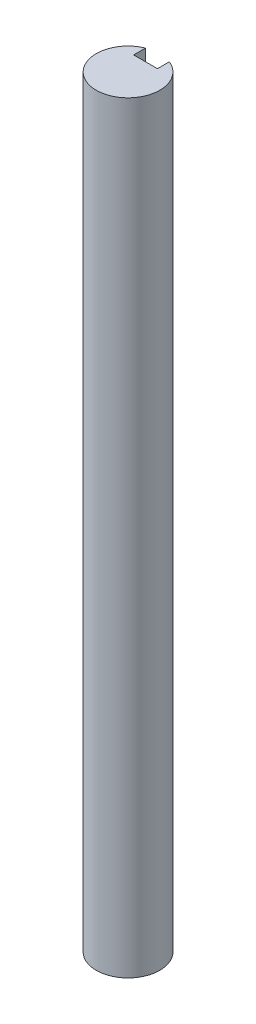
ISO-10303-21;
HEADER;
FILE_DESCRIPTION(('STEP AP214'),'2;1');
FILE_NAME('part.step','',(''),(''),'','','');
FILE_SCHEMA(('AUTOMOTIVE_DESIGN { 1 0 10303 214 1 1 1 1 }'));
ENDSEC;
DATA;
#1=APPLICATION_CONTEXT('core data for automotive mechanical design processes');
#2=APPLICATION_PROTOCOL_DEFINITION('international standard','automotive_design',2000,#1);
#3=PRODUCT_CONTEXT('',#1,'mechanical');
#4=PRODUCT('Part','Part','',(#3));
#5=PRODUCT_RELATED_PRODUCT_CATEGORY('part','',(#4));
#6=PRODUCT_DEFINITION_FORMATION('','',#4);
#7=PRODUCT_DEFINITION_CONTEXT('part definition',#1,'design');
#8=PRODUCT_DEFINITION('design','',#6,#7);
#9=PRODUCT_DEFINITION_SHAPE('','',#8);
#10=(LENGTH_UNIT() NAMED_UNIT(*) SI_UNIT(.MILLI.,.METRE.));
#11=(NAMED_UNIT(*) PLANE_ANGLE_UNIT() SI_UNIT($,.RADIAN.));
#12=(NAMED_UNIT(*) SI_UNIT($,.STERADIAN.) SOLID_ANGLE_UNIT());
#13=UNCERTAINTY_MEASURE_WITH_UNIT(LENGTH_MEASURE(1.E-05),#10,'distance_accuracy_value','');
#14=(GEOMETRIC_REPRESENTATION_CONTEXT(3) GLOBAL_UNCERTAINTY_ASSIGNED_CONTEXT((#13)) GLOBAL_UNIT_ASSIGNED_CONTEXT((#10,
#11,#12)) REPRESENTATION_CONTEXT('',''));
#15=CARTESIAN_POINT('',(0.,0.,0.));
#16=DIRECTION('',(0.,0.,1.));
#17=DIRECTION('',(1.,0.,0.));
#18=AXIS2_PLACEMENT_3D('',#15,#16,#17);
#19=CARTESIAN_POINT('',(0.,76.2,0.));
#20=DIRECTION('',(0.,-1.,0.));
#21=DIRECTION('',(0.,0.,-1.));
#22=AXIS2_PLACEMENT_3D('',#19,#20,#21);
#23=CYLINDRICAL_SURFACE('',#22,3.175);
#24=CARTESIAN_POINT('',(0.,0.,0.));
#25=DIRECTION('',(0.,1.,0.));
#26=DIRECTION('',(0.,0.,1.));
#27=AXIS2_PLACEMENT_3D('',#24,#25,#26);
#28=CIRCLE('',#27,3.175);
#29=CARTESIAN_POINT('',(-1.190625,0.,-2.94330377456609));
#30=VERTEX_POINT('',#29);
#31=CARTESIAN_POINT('',(1.190625,0.,-2.94330377456609));
#32=VERTEX_POINT('',#31);
#33=EDGE_CURVE('E97',#30,#32,#28,.T.);
#34=ORIENTED_EDGE('',*,*,#33,.T.);
#35=DIRECTION('',(0.,-1.,0.));
#36=VECTOR('',#35,1.);
#37=CARTESIAN_POINT('',(1.190625,76.2,-2.94330377456609));
#38=LINE('',#37,#36);
#39=CARTESIAN_POINT('',(1.190625,76.2,-2.94330377456609));
#40=VERTEX_POINT('',#39);
#41=EDGE_CURVE('E11',#40,#32,#38,.T.);
#42=ORIENTED_EDGE('',*,*,#41,.F.);
#43=CARTESIAN_POINT('',(0.,76.2,0.));
#44=DIRECTION('',(0.,1.,0.));
#45=DIRECTION('',(0.,0.,1.));
#46=AXIS2_PLACEMENT_3D('',#43,#44,#45);
#47=CIRCLE('',#46,3.175);
#48=CARTESIAN_POINT('',(-1.190625,76.2,-2.94330377456609));
#49=VERTEX_POINT('',#48);
#50=EDGE_CURVE('E85',#49,#40,#47,.T.);
#51=ORIENTED_EDGE('',*,*,#50,.F.);
#52=DIRECTION('',(0.,-1.,0.));
#53=VECTOR('',#52,1.);
#54=CARTESIAN_POINT('',(-1.190625,76.2,-2.94330377456609));
#55=LINE('',#54,#53);
#56=EDGE_CURVE('E93',#49,#30,#55,.T.);
#57=ORIENTED_EDGE('',*,*,#56,.T.);
#58=EDGE_LOOP('',(#34,#42,#51,#57));
#59=FACE_BOUND('',#58,.T.);
#60=ADVANCED_FACE('F34',(#59),#23,.T.);
#61=CARTESIAN_POINT('',(1.190625,76.2,-1.75267877456609));
#62=DIRECTION('',(1.,0.,0.));
#63=DIRECTION('',(0.,0.,-1.));
#64=AXIS2_PLACEMENT_3D('',#61,#62,#63);
#65=PLANE('',#64);
#66=DIRECTION('',(0.,0.,1.));
#67=VECTOR('',#66,1.);
#68=CARTESIAN_POINT('',(1.190625,0.,-1.75267877456609));
#69=LINE('',#68,#67);
#70=CARTESIAN_POINT('',(1.190625,0.,-1.75267877456609));
#71=VERTEX_POINT('',#70);
#72=EDGE_CURVE('E89',#32,#71,#69,.T.);
#73=ORIENTED_EDGE('',*,*,#72,.T.);
#74=DIRECTION('',(0.,-1.,0.));
#75=VECTOR('',#74,1.);
#76=CARTESIAN_POINT('',(1.190625,76.2,-1.75267877456609));
#77=LINE('',#76,#75);
#78=CARTESIAN_POINT('',(1.190625,76.2,-1.75267877456609));
#79=VERTEX_POINT('',#78);
#80=EDGE_CURVE('E42',#79,#71,#77,.T.);
#81=ORIENTED_EDGE('',*,*,#80,.F.);
#82=DIRECTION('',(0.,0.,1.));
#83=VECTOR('',#82,1.);
#84=CARTESIAN_POINT('',(1.190625,76.2,-1.75267877456609));
#85=LINE('',#84,#83);
#86=EDGE_CURVE('E80',#40,#79,#85,.T.);
#87=ORIENTED_EDGE('',*,*,#86,.F.);
#88=ORIENTED_EDGE('',*,*,#41,.T.);
#89=EDGE_LOOP('',(#73,#81,#87,#88));
#90=FACE_BOUND('',#89,.T.);
#91=ADVANCED_FACE('F88',(#90),#65,.F.);
#92=CARTESIAN_POINT('',(-1.190625,76.2,-1.75267877456609));
#93=DIRECTION('',(0.,0.,1.));
#94=DIRECTION('',(1.,0.,0.));
#95=AXIS2_PLACEMENT_3D('',#92,#93,#94);
#96=PLANE('',#95);
#97=DIRECTION('',(-1.,0.,0.));
#98=VECTOR('',#97,1.);
#99=CARTESIAN_POINT('',(-1.190625,0.,-1.75267877456609));
#100=LINE('',#99,#98);
#101=CARTESIAN_POINT('',(-1.190625,0.,-1.75267877456609));
#102=VERTEX_POINT('',#101);
#103=EDGE_CURVE('E67',#71,#102,#100,.T.);
#104=ORIENTED_EDGE('',*,*,#103,.T.);
#105=DIRECTION('',(0.,-1.,0.));
#106=VECTOR('',#105,1.);
#107=CARTESIAN_POINT('',(-1.190625,76.2,-1.75267877456609));
#108=LINE('',#107,#106);
#109=CARTESIAN_POINT('',(-1.190625,76.2,-1.75267877456609));
#110=VERTEX_POINT('',#109);
#111=EDGE_CURVE('E90',#110,#102,#108,.T.);
#112=ORIENTED_EDGE('',*,*,#111,.F.);
#113=DIRECTION('',(-1.,0.,0.));
#114=VECTOR('',#113,1.);
#115=CARTESIAN_POINT('',(-1.190625,76.2,-1.75267877456609));
#116=LINE('',#115,#114);
#117=EDGE_CURVE('E83',#79,#110,#116,.T.);
#118=ORIENTED_EDGE('',*,*,#117,.F.);
#119=ORIENTED_EDGE('',*,*,#80,.T.);
#120=EDGE_LOOP('',(#104,#112,#118,#119));
#121=FACE_BOUND('',#120,.T.);
#122=ADVANCED_FACE('F91',(#121),#96,.F.);
#123=CARTESIAN_POINT('',(-1.190625,76.2,-2.94330377456609));
#124=DIRECTION('',(-1.,0.,0.));
#125=DIRECTION('',(0.,0.,1.));
#126=AXIS2_PLACEMENT_3D('',#123,#124,#125);
#127=PLANE('',#126);
#128=DIRECTION('',(0.,0.,-1.));
#129=VECTOR('',#128,1.);
#130=CARTESIAN_POINT('',(-1.190625,0.,-2.94330377456609));
#131=LINE('',#130,#129);
#132=EDGE_CURVE('E73',#102,#30,#131,.T.);
#133=ORIENTED_EDGE('',*,*,#132,.T.);
#134=ORIENTED_EDGE('',*,*,#56,.F.);
#135=DIRECTION('',(0.,0.,-1.));
#136=VECTOR('',#135,1.);
#137=CARTESIAN_POINT('',(-1.190625,76.2,-2.94330377456609));
#138=LINE('',#137,#136);
#139=EDGE_CURVE('E50',#110,#49,#138,.T.);
#140=ORIENTED_EDGE('',*,*,#139,.F.);
#141=ORIENTED_EDGE('',*,*,#111,.T.);
#142=EDGE_LOOP('',(#133,#134,#140,#141));
#143=FACE_BOUND('',#142,.T.);
#144=ADVANCED_FACE('F104',(#143),#127,.F.);
#145=CARTESIAN_POINT('',(0.,76.2,0.));
#146=DIRECTION('',(0.,1.,0.));
#147=DIRECTION('',(0.,0.,1.));
#148=AXIS2_PLACEMENT_3D('',#145,#146,#147);
#149=PLANE('',#148);
#150=ORIENTED_EDGE('',*,*,#50,.T.);
#151=ORIENTED_EDGE('',*,*,#86,.T.);
#152=ORIENTED_EDGE('',*,*,#117,.T.);
#153=ORIENTED_EDGE('',*,*,#139,.T.);
#154=EDGE_LOOP('',(#150,#151,#152,#153));
#155=FACE_BOUND('',#154,.T.);
#156=ADVANCED_FACE('F81',(#155),#149,.T.);
#157=CARTESIAN_POINT('',(0.,0.,0.));
#158=DIRECTION('',(0.,1.,0.));
#159=DIRECTION('',(0.,0.,1.));
#160=AXIS2_PLACEMENT_3D('',#157,#158,#159);
#161=PLANE('',#160);
#162=ORIENTED_EDGE('',*,*,#33,.F.);
#163=ORIENTED_EDGE('',*,*,#132,.F.);
#164=ORIENTED_EDGE('',*,*,#103,.F.);
#165=ORIENTED_EDGE('',*,*,#72,.F.);
#166=EDGE_LOOP('',(#162,#163,#164,#165));
#167=FACE_BOUND('',#166,.T.);
#168=ADVANCED_FACE('F107',(#167),#161,.F.);
#169=CLOSED_SHELL('',(#60,#91,#122,#144,#156,#168));
#170=MANIFOLD_SOLID_BREP('B2',#169);
#171=ADVANCED_BREP_SHAPE_REPRESENTATION('',(#18,#170),#14);
#172=SHAPE_DEFINITION_REPRESENTATION(#9,#171);
ENDSEC;
END-ISO-10303-21;
